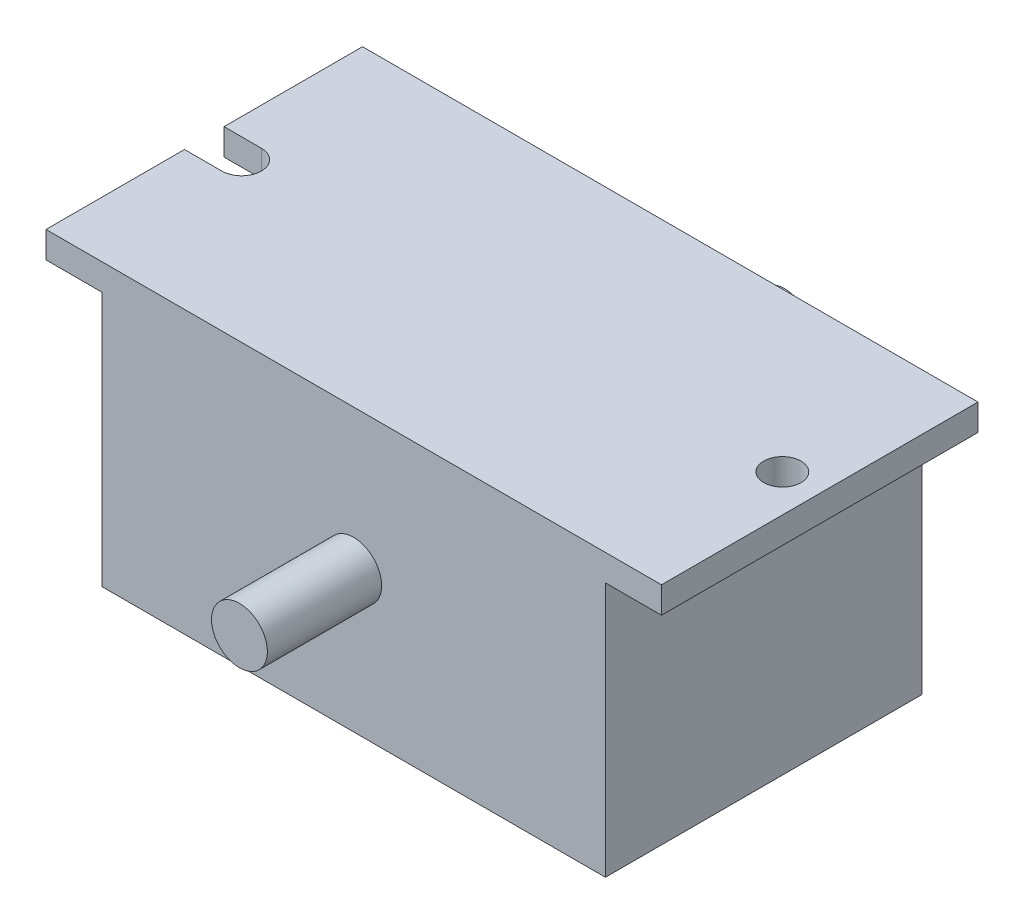
ISO-10303-21;
HEADER;
FILE_DESCRIPTION(('STEP AP214'),'2;1');
FILE_NAME('part.step','',(''),(''),'','','');
FILE_SCHEMA(('AUTOMOTIVE_DESIGN { 1 0 10303 214 1 1 1 1 }'));
ENDSEC;
DATA;
#1=APPLICATION_CONTEXT('core data for automotive mechanical design processes');
#2=APPLICATION_PROTOCOL_DEFINITION('international standard','automotive_design',2000,#1);
#3=PRODUCT_CONTEXT('',#1,'mechanical');
#4=PRODUCT('Part','Part','',(#3));
#5=PRODUCT_RELATED_PRODUCT_CATEGORY('part','',(#4));
#6=PRODUCT_DEFINITION_FORMATION('','',#4);
#7=PRODUCT_DEFINITION_CONTEXT('part definition',#1,'design');
#8=PRODUCT_DEFINITION('design','',#6,#7);
#9=PRODUCT_DEFINITION_SHAPE('','',#8);
#10=(LENGTH_UNIT() NAMED_UNIT(*) SI_UNIT(.MILLI.,.METRE.));
#11=(NAMED_UNIT(*) PLANE_ANGLE_UNIT() SI_UNIT($,.RADIAN.));
#12=(NAMED_UNIT(*) SI_UNIT($,.STERADIAN.) SOLID_ANGLE_UNIT());
#13=UNCERTAINTY_MEASURE_WITH_UNIT(LENGTH_MEASURE(1.E-05),#10,'distance_accuracy_value','');
#14=(GEOMETRIC_REPRESENTATION_CONTEXT(3) GLOBAL_UNCERTAINTY_ASSIGNED_CONTEXT((#13)) GLOBAL_UNIT_ASSIGNED_CONTEXT((#10,
#11,#12)) REPRESENTATION_CONTEXT('',''));
#15=CARTESIAN_POINT('',(0.,0.,0.));
#16=DIRECTION('',(0.,0.,1.));
#17=DIRECTION('',(1.,0.,0.));
#18=AXIS2_PLACEMENT_3D('',#15,#16,#17);
#19=CARTESIAN_POINT('',(-70.,32.,72.));
#20=DIRECTION('',(1.,0.,0.));
#21=DIRECTION('',(0.,0.,-1.));
#22=AXIS2_PLACEMENT_3D('',#19,#20,#21);
#23=PLANE('',#22);
#24=DIRECTION('',(0.,0.,-1.));
#25=VECTOR('',#24,1.);
#26=CARTESIAN_POINT('',(-70.,32.,72.));
#27=LINE('',#26,#25);
#28=CARTESIAN_POINT('',(-70.,32.,72.));
#29=VERTEX_POINT('',#28);
#30=CARTESIAN_POINT('',(-70.,32.,40.5));
#31=VERTEX_POINT('',#30);
#32=EDGE_CURVE('E270',#29,#31,#27,.T.);
#33=ORIENTED_EDGE('',*,*,#32,.T.);
#34=DIRECTION('',(0.,1.,0.));
#35=VECTOR('',#34,1.);
#36=CARTESIAN_POINT('',(-70.,-32.0000000000002,40.5));
#37=LINE('',#36,#35);
#38=CARTESIAN_POINT('',(-70.,26.,40.5));
#39=VERTEX_POINT('',#38);
#40=EDGE_CURVE('E179',#39,#31,#37,.T.);
#41=ORIENTED_EDGE('',*,*,#40,.F.);
#42=DIRECTION('',(0.,0.,-1.));
#43=VECTOR('',#42,1.);
#44=CARTESIAN_POINT('',(-70.,26.,72.));
#45=LINE('',#44,#43);
#46=CARTESIAN_POINT('',(-70.,26.,72.));
#47=VERTEX_POINT('',#46);
#48=EDGE_CURVE('E266',#47,#39,#45,.T.);
#49=ORIENTED_EDGE('',*,*,#48,.F.);
#50=DIRECTION('',(0.,-1.,0.));
#51=VECTOR('',#50,1.);
#52=CARTESIAN_POINT('',(-70.,32.,72.));
#53=LINE('',#52,#51);
#54=EDGE_CURVE('E212',#29,#47,#53,.T.);
#55=ORIENTED_EDGE('',*,*,#54,.F.);
#56=EDGE_LOOP('',(#33,#41,#49,#55));
#57=FACE_BOUND('',#56,.T.);
#58=ADVANCED_FACE('F39',(#57),#23,.F.);
#59=CARTESIAN_POINT('',(-70.,26.,72.));
#60=DIRECTION('',(0.,1.,0.));
#61=DIRECTION('',(0.,0.,1.));
#62=AXIS2_PLACEMENT_3D('',#59,#60,#61);
#63=PLANE('',#62);
#64=DIRECTION('',(1.,0.,0.));
#65=VECTOR('',#64,1.);
#66=CARTESIAN_POINT('',(-70.,26.,40.5));
#67=LINE('',#66,#65);
#68=CARTESIAN_POINT('',(-61.5,26.,40.5));
#69=VERTEX_POINT('',#68);
#70=EDGE_CURVE('E48',#39,#69,#67,.T.);
#71=ORIENTED_EDGE('',*,*,#70,.T.);
#72=CARTESIAN_POINT('',(-61.5,26.,36.));
#73=DIRECTION('',(0.,1.,0.));
#74=DIRECTION('',(0.,0.,1.));
#75=AXIS2_PLACEMENT_3D('',#72,#73,#74);
#76=CIRCLE('',#75,4.5);
#77=CARTESIAN_POINT('',(-57.2500000000001,26.,37.479019945775));
#78=VERTEX_POINT('',#77);
#79=EDGE_CURVE('E188',#69,#78,#76,.T.);
#80=ORIENTED_EDGE('',*,*,#79,.T.);
#81=DIRECTION('',(0.,0.,-1.));
#82=VECTOR('',#81,1.);
#83=CARTESIAN_POINT('',(-57.25,26.,72.));
#84=LINE('',#83,#82);
#85=CARTESIAN_POINT('',(-57.25,26.,72.));
#86=VERTEX_POINT('',#85);
#87=EDGE_CURVE('E261',#86,#78,#84,.T.);
#88=ORIENTED_EDGE('',*,*,#87,.F.);
#89=DIRECTION('',(1.,0.,0.));
#90=VECTOR('',#89,1.);
#91=CARTESIAN_POINT('',(-70.,26.,72.));
#92=LINE('',#91,#90);
#93=EDGE_CURVE('E215',#47,#86,#92,.T.);
#94=ORIENTED_EDGE('',*,*,#93,.F.);
#95=ORIENTED_EDGE('',*,*,#48,.T.);
#96=EDGE_LOOP('',(#71,#80,#88,#94,#95));
#97=FACE_BOUND('',#96,.T.);
#98=ADVANCED_FACE('F294',(#97),#63,.F.);
#99=CARTESIAN_POINT('',(-57.25,26.,72.));
#100=DIRECTION('',(1.,0.,0.));
#101=DIRECTION('',(0.,1.,0.));
#102=AXIS2_PLACEMENT_3D('',#99,#100,#101);
#103=PLANE('',#102);
#104=DIRECTION('',(0.,0.,-1.));
#105=VECTOR('',#104,1.);
#106=CARTESIAN_POINT('',(-57.25,-32.,72.));
#107=LINE('',#106,#105);
#108=CARTESIAN_POINT('',(-57.25,-32.,34.520980054225));
#109=VERTEX_POINT('',#108);
#110=CARTESIAN_POINT('',(-57.25,-32.,0.));
#111=VERTEX_POINT('',#110);
#112=EDGE_CURVE('E255',#109,#111,#107,.T.);
#113=ORIENTED_EDGE('',*,*,#112,.F.);
#114=DIRECTION('',(0.,1.,0.));
#115=VECTOR('',#114,1.);
#116=CARTESIAN_POINT('',(-57.25,-32.0000000000001,34.520980054225));
#117=LINE('',#116,#115);
#118=CARTESIAN_POINT('',(-57.2500000000001,26.,34.520980054225));
#119=VERTEX_POINT('',#118);
#120=EDGE_CURVE('E60',#109,#119,#117,.T.);
#121=ORIENTED_EDGE('',*,*,#120,.T.);
#122=CARTESIAN_POINT('',(-57.25,26.,0.));
#123=VERTEX_POINT('',#122);
#124=EDGE_CURVE('E260',#119,#123,#84,.T.);
#125=ORIENTED_EDGE('',*,*,#124,.T.);
#126=DIRECTION('',(0.,-1.,0.));
#127=VECTOR('',#126,1.);
#128=CARTESIAN_POINT('',(-57.25,26.,0.));
#129=LINE('',#128,#127);
#130=EDGE_CURVE('E246',#123,#111,#129,.T.);
#131=ORIENTED_EDGE('',*,*,#130,.T.);
#132=EDGE_LOOP('',(#113,#121,#125,#131));
#133=FACE_BOUND('',#132,.T.);
#134=ADVANCED_FACE('F370',(#133),#103,.F.);
#135=CARTESIAN_POINT('',(57.25,26.,72.));
#136=DIRECTION('',(-1.,0.,0.));
#137=DIRECTION('',(0.,-1.,0.));
#138=AXIS2_PLACEMENT_3D('',#135,#136,#137);
#139=PLANE('',#138);
#140=DIRECTION('',(0.,0.,-1.));
#141=VECTOR('',#140,1.);
#142=CARTESIAN_POINT('',(57.25,-32.,72.));
#143=LINE('',#142,#141);
#144=CARTESIAN_POINT('',(57.25,-32.,72.));
#145=VERTEX_POINT('',#144);
#146=CARTESIAN_POINT('',(57.25,-32.,0.));
#147=VERTEX_POINT('',#146);
#148=EDGE_CURVE('E224',#145,#147,#143,.T.);
#149=ORIENTED_EDGE('',*,*,#148,.T.);
#150=DIRECTION('',(0.,1.,0.));
#151=VECTOR('',#150,1.);
#152=CARTESIAN_POINT('',(57.25,26.,0.));
#153=LINE('',#152,#151);
#154=CARTESIAN_POINT('',(57.25,26.,0.));
#155=VERTEX_POINT('',#154);
#156=EDGE_CURVE('E197',#147,#155,#153,.T.);
#157=ORIENTED_EDGE('',*,*,#156,.T.);
#158=DIRECTION('',(0.,0.,-1.));
#159=VECTOR('',#158,1.);
#160=CARTESIAN_POINT('',(57.25,26.,72.));
#161=LINE('',#160,#159);
#162=CARTESIAN_POINT('',(57.25,26.,36.));
#163=VERTEX_POINT('',#162);
#164=EDGE_CURVE('E282',#163,#155,#161,.T.);
#165=ORIENTED_EDGE('',*,*,#164,.F.);
#166=CARTESIAN_POINT('',(57.25,26.,72.));
#167=VERTEX_POINT('',#166);
#168=EDGE_CURVE('E283',#167,#163,#161,.T.);
#169=ORIENTED_EDGE('',*,*,#168,.F.);
#170=DIRECTION('',(0.,1.,0.));
#171=VECTOR('',#170,1.);
#172=CARTESIAN_POINT('',(57.25,26.,72.));
#173=LINE('',#172,#171);
#174=EDGE_CURVE('E198',#145,#167,#173,.T.);
#175=ORIENTED_EDGE('',*,*,#174,.F.);
#176=EDGE_LOOP('',(#149,#157,#165,#169,#175));
#177=FACE_BOUND('',#176,.T.);
#178=ADVANCED_FACE('F41',(#177),#139,.F.);
#179=CARTESIAN_POINT('',(70.,26.,72.));
#180=DIRECTION('',(0.,1.,0.));
#181=DIRECTION('',(0.,0.,1.));
#182=AXIS2_PLACEMENT_3D('',#179,#180,#181);
#183=PLANE('',#182);
#184=ORIENTED_EDGE('',*,*,#168,.T.);
#185=CARTESIAN_POINT('',(61.5,26.,36.));
#186=DIRECTION('',(0.,1.,0.));
#187=DIRECTION('',(0.,0.,1.));
#188=AXIS2_PLACEMENT_3D('',#185,#186,#187);
#189=CIRCLE('',#188,4.25);
#190=EDGE_CURVE('E53',#163,#163,#189,.T.);
#191=ORIENTED_EDGE('',*,*,#190,.T.);
#192=ORIENTED_EDGE('',*,*,#164,.T.);
#193=DIRECTION('',(1.,0.,0.));
#194=VECTOR('',#193,1.);
#195=CARTESIAN_POINT('',(70.,26.,0.));
#196=LINE('',#195,#194);
#197=CARTESIAN_POINT('',(70.,26.,0.));
#198=VERTEX_POINT('',#197);
#199=EDGE_CURVE('E228',#155,#198,#196,.T.);
#200=ORIENTED_EDGE('',*,*,#199,.T.);
#201=DIRECTION('',(0.,0.,-1.));
#202=VECTOR('',#201,1.);
#203=CARTESIAN_POINT('',(70.,26.,72.));
#204=LINE('',#203,#202);
#205=CARTESIAN_POINT('',(70.,26.,72.));
#206=VERTEX_POINT('',#205);
#207=EDGE_CURVE('E278',#206,#198,#204,.T.);
#208=ORIENTED_EDGE('',*,*,#207,.F.);
#209=DIRECTION('',(1.,0.,0.));
#210=VECTOR('',#209,1.);
#211=CARTESIAN_POINT('',(70.,26.,72.));
#212=LINE('',#211,#210);
#213=EDGE_CURVE('E202',#167,#206,#212,.T.);
#214=ORIENTED_EDGE('',*,*,#213,.F.);
#215=EDGE_LOOP('',(#184,#191,#192,#200,#208,#214));
#216=FACE_BOUND('',#215,.T.);
#217=ADVANCED_FACE('F385',(#216),#183,.F.);
#218=CARTESIAN_POINT('',(70.,32.,72.));
#219=DIRECTION('',(-1.,0.,0.));
#220=DIRECTION('',(0.,0.,1.));
#221=AXIS2_PLACEMENT_3D('',#218,#219,#220);
#222=PLANE('',#221);
#223=DIRECTION('',(0.,1.,0.));
#224=VECTOR('',#223,1.);
#225=CARTESIAN_POINT('',(70.,32.,0.));
#226=LINE('',#225,#224);
#227=CARTESIAN_POINT('',(70.,32.,0.));
#228=VERTEX_POINT('',#227);
#229=EDGE_CURVE('E231',#198,#228,#226,.T.);
#230=ORIENTED_EDGE('',*,*,#229,.T.);
#231=DIRECTION('',(0.,0.,-1.));
#232=VECTOR('',#231,1.);
#233=CARTESIAN_POINT('',(70.,32.,72.));
#234=LINE('',#233,#232);
#235=CARTESIAN_POINT('',(70.,32.,72.));
#236=VERTEX_POINT('',#235);
#237=EDGE_CURVE('E274',#236,#228,#234,.T.);
#238=ORIENTED_EDGE('',*,*,#237,.F.);
#239=DIRECTION('',(0.,1.,0.));
#240=VECTOR('',#239,1.);
#241=CARTESIAN_POINT('',(70.,32.,72.));
#242=LINE('',#241,#240);
#243=EDGE_CURVE('E206',#206,#236,#242,.T.);
#244=ORIENTED_EDGE('',*,*,#243,.F.);
#245=ORIENTED_EDGE('',*,*,#207,.T.);
#246=EDGE_LOOP('',(#230,#238,#244,#245));
#247=FACE_BOUND('',#246,.T.);
#248=ADVANCED_FACE('F311',(#247),#222,.F.);
#249=CARTESIAN_POINT('',(-57.25,32.,72.));
#250=DIRECTION('',(0.,-1.,0.));
#251=DIRECTION('',(1.,0.,0.));
#252=AXIS2_PLACEMENT_3D('',#249,#250,#251);
#253=PLANE('',#252);
#254=CARTESIAN_POINT('',(61.5,32.0000000000001,36.));
#255=DIRECTION('',(0.,1.,0.));
#256=DIRECTION('',(-1.,0.,0.));
#257=AXIS2_PLACEMENT_3D('',#254,#255,#256);
#258=CIRCLE('',#257,4.25);
#259=CARTESIAN_POINT('',(57.25,32.0000000000001,36.));
#260=VERTEX_POINT('',#259);
#261=EDGE_CURVE('E178',#260,#260,#258,.T.);
#262=ORIENTED_EDGE('',*,*,#261,.F.);
#263=EDGE_LOOP('',(#262));
#264=FACE_BOUND('',#263,.T.);
#265=CARTESIAN_POINT('',(-61.5,32.,36.));
#266=DIRECTION('',(0.,1.,0.));
#267=DIRECTION('',(-1.,0.,0.));
#268=AXIS2_PLACEMENT_3D('',#265,#266,#267);
#269=CIRCLE('',#268,4.5);
#270=CARTESIAN_POINT('',(-61.5,32.,40.5));
#271=VERTEX_POINT('',#270);
#272=CARTESIAN_POINT('',(-61.5,32.,31.5));
#273=VERTEX_POINT('',#272);
#274=EDGE_CURVE('E156',#271,#273,#269,.T.);
#275=ORIENTED_EDGE('',*,*,#274,.F.);
#276=DIRECTION('',(1.,0.,0.));
#277=VECTOR('',#276,1.);
#278=CARTESIAN_POINT('',(-61.5,32.,40.5));
#279=LINE('',#278,#277);
#280=EDGE_CURVE('E153',#31,#271,#279,.T.);
#281=ORIENTED_EDGE('',*,*,#280,.F.);
#282=ORIENTED_EDGE('',*,*,#32,.F.);
#283=DIRECTION('',(-1.,0.,0.));
#284=VECTOR('',#283,1.);
#285=CARTESIAN_POINT('',(57.25,32.,72.));
#286=LINE('',#285,#284);
#287=EDGE_CURVE('E209',#236,#29,#286,.T.);
#288=ORIENTED_EDGE('',*,*,#287,.F.);
#289=ORIENTED_EDGE('',*,*,#237,.T.);
#290=DIRECTION('',(-1.,0.,0.));
#291=VECTOR('',#290,1.);
#292=CARTESIAN_POINT('',(-57.25,32.,0.));
#293=LINE('',#292,#291);
#294=CARTESIAN_POINT('',(-70.,32.,0.));
#295=VERTEX_POINT('',#294);
#296=EDGE_CURVE('E235',#228,#295,#293,.T.);
#297=ORIENTED_EDGE('',*,*,#296,.T.);
#298=CARTESIAN_POINT('',(-70.,32.,31.5));
#299=VERTEX_POINT('',#298);
#300=EDGE_CURVE('E169',#299,#295,#27,.T.);
#301=ORIENTED_EDGE('',*,*,#300,.F.);
#302=DIRECTION('',(-1.,0.,0.));
#303=VECTOR('',#302,1.);
#304=CARTESIAN_POINT('',(-61.5,32.,31.5));
#305=LINE('',#304,#303);
#306=EDGE_CURVE('E146',#273,#299,#305,.T.);
#307=ORIENTED_EDGE('',*,*,#306,.F.);
#308=EDGE_LOOP('',(#275,#281,#282,#288,#289,#297,#301,#307));
#309=FACE_BOUND('',#308,.T.);
#310=ADVANCED_FACE('F167',(#264,#309),#253,.F.);
#311=CARTESIAN_POINT('',(-70.,26.,31.5));
#312=VERTEX_POINT('',#311);
#313=CARTESIAN_POINT('',(-70.,26.,0.));
#314=VERTEX_POINT('',#313);
#315=EDGE_CURVE('E265',#312,#314,#45,.T.);
#316=ORIENTED_EDGE('',*,*,#315,.F.);
#317=DIRECTION('',(0.,1.,0.));
#318=VECTOR('',#317,1.);
#319=CARTESIAN_POINT('',(-70.,-32.0000000000002,31.5));
#320=LINE('',#319,#318);
#321=EDGE_CURVE('E152',#312,#299,#320,.T.);
#322=ORIENTED_EDGE('',*,*,#321,.T.);
#323=ORIENTED_EDGE('',*,*,#300,.T.);
#324=DIRECTION('',(0.,-1.,0.));
#325=VECTOR('',#324,1.);
#326=CARTESIAN_POINT('',(-70.,32.,0.));
#327=LINE('',#326,#325);
#328=EDGE_CURVE('E238',#295,#314,#327,.T.);
#329=ORIENTED_EDGE('',*,*,#328,.T.);
#330=EDGE_LOOP('',(#316,#322,#323,#329));
#331=FACE_BOUND('',#330,.T.);
#332=ADVANCED_FACE('F322',(#331),#23,.F.);
#333=ORIENTED_EDGE('',*,*,#124,.F.);
#334=CARTESIAN_POINT('',(-61.5,26.,31.5));
#335=VERTEX_POINT('',#334);
#336=EDGE_CURVE('E192',#119,#335,#76,.T.);
#337=ORIENTED_EDGE('',*,*,#336,.T.);
#338=DIRECTION('',(-1.,0.,0.));
#339=VECTOR('',#338,1.);
#340=CARTESIAN_POINT('',(-70.,26.,31.5));
#341=LINE('',#340,#339);
#342=EDGE_CURVE('E149',#335,#312,#341,.T.);
#343=ORIENTED_EDGE('',*,*,#342,.T.);
#344=ORIENTED_EDGE('',*,*,#315,.T.);
#345=DIRECTION('',(1.,0.,0.));
#346=VECTOR('',#345,1.);
#347=CARTESIAN_POINT('',(-70.,26.,0.));
#348=LINE('',#347,#346);
#349=EDGE_CURVE('E242',#314,#123,#348,.T.);
#350=ORIENTED_EDGE('',*,*,#349,.T.);
#351=EDGE_LOOP('',(#333,#337,#343,#344,#350));
#352=FACE_BOUND('',#351,.T.);
#353=ADVANCED_FACE('F372',(#352),#63,.F.);
#354=ORIENTED_EDGE('',*,*,#87,.T.);
#355=DIRECTION('',(0.,1.,0.));
#356=VECTOR('',#355,1.);
#357=CARTESIAN_POINT('',(-57.25,-32.0000000000001,37.479019945775));
#358=LINE('',#357,#356);
#359=CARTESIAN_POINT('',(-57.25,-32.0000000000001,37.479019945775));
#360=VERTEX_POINT('',#359);
#361=EDGE_CURVE('E184',#78,#360,#358,.F.);
#362=ORIENTED_EDGE('',*,*,#361,.T.);
#363=CARTESIAN_POINT('',(-57.25,-32.,72.));
#364=VERTEX_POINT('',#363);
#365=EDGE_CURVE('E256',#364,#360,#107,.T.);
#366=ORIENTED_EDGE('',*,*,#365,.F.);
#367=DIRECTION('',(0.,-1.,0.));
#368=VECTOR('',#367,1.);
#369=CARTESIAN_POINT('',(-57.25,26.,72.));
#370=LINE('',#369,#368);
#371=EDGE_CURVE('E218',#86,#364,#370,.T.);
#372=ORIENTED_EDGE('',*,*,#371,.F.);
#373=EDGE_LOOP('',(#354,#362,#366,#372));
#374=FACE_BOUND('',#373,.T.);
#375=ADVANCED_FACE('F379',(#374),#103,.F.);
#376=CARTESIAN_POINT('',(-57.25,-32.,72.));
#377=DIRECTION('',(0.,1.,0.));
#378=DIRECTION('',(0.,0.,1.));
#379=AXIS2_PLACEMENT_3D('',#376,#377,#378);
#380=PLANE('',#379);
#381=ORIENTED_EDGE('',*,*,#365,.T.);
#382=CARTESIAN_POINT('',(-61.5,-32.,36.));
#383=DIRECTION('',(0.,1.,0.));
#384=DIRECTION('',(0.,0.,1.));
#385=AXIS2_PLACEMENT_3D('',#382,#383,#384);
#386=CIRCLE('',#385,4.5);
#387=EDGE_CURVE('E287',#360,#109,#386,.T.);
#388=ORIENTED_EDGE('',*,*,#387,.T.);
#389=ORIENTED_EDGE('',*,*,#112,.T.);
#390=DIRECTION('',(1.,0.,0.));
#391=VECTOR('',#390,1.);
#392=CARTESIAN_POINT('',(-57.25,-32.,0.));
#393=LINE('',#392,#391);
#394=EDGE_CURVE('E203',#111,#147,#393,.T.);
#395=ORIENTED_EDGE('',*,*,#394,.T.);
#396=ORIENTED_EDGE('',*,*,#148,.F.);
#397=DIRECTION('',(1.,0.,0.));
#398=VECTOR('',#397,1.);
#399=CARTESIAN_POINT('',(-57.25,-32.,72.));
#400=LINE('',#399,#398);
#401=EDGE_CURVE('E221',#364,#145,#400,.T.);
#402=ORIENTED_EDGE('',*,*,#401,.F.);
#403=EDGE_LOOP('',(#381,#388,#389,#395,#396,#402));
#404=FACE_BOUND('',#403,.T.);
#405=ADVANCED_FACE('F361',(#404),#380,.F.);
#406=CARTESIAN_POINT('',(0.,0.,72.));
#407=DIRECTION('',(0.,0.,1.));
#408=DIRECTION('',(1.,0.,0.));
#409=AXIS2_PLACEMENT_3D('',#406,#407,#408);
#410=PLANE('',#409);
#411=CARTESIAN_POINT('',(0.,0.,72.));
#412=DIRECTION('',(0.,0.,1.));
#413=DIRECTION('',(1.,0.,0.));
#414=AXIS2_PLACEMENT_3D('',#411,#412,#413);
#415=CIRCLE('',#414,6.35);
#416=CARTESIAN_POINT('',(-6.35,0.,72.));
#417=VERTEX_POINT('',#416);
#418=EDGE_CURVE('E333',#417,#417,#415,.T.);
#419=ORIENTED_EDGE('',*,*,#418,.F.);
#420=EDGE_LOOP('',(#419));
#421=FACE_BOUND('',#420,.T.);
#422=ORIENTED_EDGE('',*,*,#174,.T.);
#423=ORIENTED_EDGE('',*,*,#213,.T.);
#424=ORIENTED_EDGE('',*,*,#243,.T.);
#425=ORIENTED_EDGE('',*,*,#287,.T.);
#426=ORIENTED_EDGE('',*,*,#54,.T.);
#427=ORIENTED_EDGE('',*,*,#93,.T.);
#428=ORIENTED_EDGE('',*,*,#371,.T.);
#429=ORIENTED_EDGE('',*,*,#401,.T.);
#430=EDGE_LOOP('',(#422,#423,#424,#425,#426,#427,#428,#429));
#431=FACE_BOUND('',#430,.T.);
#432=ADVANCED_FACE('F307',(#421,#431),#410,.T.);
#433=CARTESIAN_POINT('',(0.,0.,0.));
#434=DIRECTION('',(0.,0.,1.));
#435=DIRECTION('',(1.,0.,0.));
#436=AXIS2_PLACEMENT_3D('',#433,#434,#435);
#437=PLANE('',#436);
#438=CARTESIAN_POINT('',(0.,0.,0.));
#439=DIRECTION('',(0.,0.,1.));
#440=DIRECTION('',(1.,0.,0.));
#441=AXIS2_PLACEMENT_3D('',#438,#439,#440);
#442=CIRCLE('',#441,6.35);
#443=CARTESIAN_POINT('',(6.35,0.,0.));
#444=VERTEX_POINT('',#443);
#445=EDGE_CURVE('E11',#444,#444,#442,.F.);
#446=ORIENTED_EDGE('',*,*,#445,.F.);
#447=EDGE_LOOP('',(#446));
#448=FACE_BOUND('',#447,.T.);
#449=ORIENTED_EDGE('',*,*,#156,.F.);
#450=ORIENTED_EDGE('',*,*,#394,.F.);
#451=ORIENTED_EDGE('',*,*,#130,.F.);
#452=ORIENTED_EDGE('',*,*,#349,.F.);
#453=ORIENTED_EDGE('',*,*,#328,.F.);
#454=ORIENTED_EDGE('',*,*,#296,.F.);
#455=ORIENTED_EDGE('',*,*,#229,.F.);
#456=ORIENTED_EDGE('',*,*,#199,.F.);
#457=EDGE_LOOP('',(#449,#450,#451,#452,#453,#454,#455,#456));
#458=FACE_BOUND('',#457,.T.);
#459=ADVANCED_FACE('F316',(#448,#458),#437,.F.);
#460=CARTESIAN_POINT('',(-61.5,-32.0000000000001,40.5));
#461=DIRECTION('',(0.,0.,1.));
#462=DIRECTION('',(1.,0.,0.));
#463=AXIS2_PLACEMENT_3D('',#460,#461,#462);
#464=PLANE('',#463);
#465=ORIENTED_EDGE('',*,*,#40,.T.);
#466=ORIENTED_EDGE('',*,*,#280,.T.);
#467=DIRECTION('',(0.,1.,0.));
#468=VECTOR('',#467,1.);
#469=CARTESIAN_POINT('',(-61.5,-32.0000000000001,40.5));
#470=LINE('',#469,#468);
#471=EDGE_CURVE('E159',#69,#271,#470,.T.);
#472=ORIENTED_EDGE('',*,*,#471,.F.);
#473=ORIENTED_EDGE('',*,*,#70,.F.);
#474=EDGE_LOOP('',(#465,#466,#472,#473));
#475=FACE_BOUND('',#474,.T.);
#476=ADVANCED_FACE('F300',(#475),#464,.F.);
#477=CARTESIAN_POINT('',(-61.5,-32.0000000000001,31.5));
#478=DIRECTION('',(0.,0.,-1.));
#479=DIRECTION('',(-1.,0.,0.));
#480=AXIS2_PLACEMENT_3D('',#477,#478,#479);
#481=PLANE('',#480);
#482=DIRECTION('',(0.,1.,0.));
#483=VECTOR('',#482,1.);
#484=CARTESIAN_POINT('',(-61.5,-32.0000000000001,31.5));
#485=LINE('',#484,#483);
#486=EDGE_CURVE('E142',#335,#273,#485,.T.);
#487=ORIENTED_EDGE('',*,*,#486,.T.);
#488=ORIENTED_EDGE('',*,*,#306,.T.);
#489=ORIENTED_EDGE('',*,*,#321,.F.);
#490=ORIENTED_EDGE('',*,*,#342,.F.);
#491=EDGE_LOOP('',(#487,#488,#489,#490));
#492=FACE_BOUND('',#491,.T.);
#493=ADVANCED_FACE('F144',(#492),#481,.F.);
#494=CARTESIAN_POINT('',(-61.5,-32.0000000000001,36.));
#495=DIRECTION('',(0.,1.,0.));
#496=DIRECTION('',(-1.,0.,0.));
#497=AXIS2_PLACEMENT_3D('',#494,#495,#496);
#498=CYLINDRICAL_SURFACE('',#497,4.5);
#499=ORIENTED_EDGE('',*,*,#120,.F.);
#500=ORIENTED_EDGE('',*,*,#387,.F.);
#501=ORIENTED_EDGE('',*,*,#361,.F.);
#502=ORIENTED_EDGE('',*,*,#79,.F.);
#503=ORIENTED_EDGE('',*,*,#471,.T.);
#504=ORIENTED_EDGE('',*,*,#274,.T.);
#505=ORIENTED_EDGE('',*,*,#486,.F.);
#506=ORIENTED_EDGE('',*,*,#336,.F.);
#507=EDGE_LOOP('',(#499,#500,#501,#502,#503,#504,#505,#506));
#508=FACE_BOUND('',#507,.T.);
#509=ADVANCED_FACE('F157',(#508),#498,.F.);
#510=CARTESIAN_POINT('',(61.5,-32.,36.));
#511=DIRECTION('',(0.,1.,0.));
#512=DIRECTION('',(-1.,0.,0.));
#513=AXIS2_PLACEMENT_3D('',#510,#511,#512);
#514=CYLINDRICAL_SURFACE('',#513,4.25);
#515=ORIENTED_EDGE('',*,*,#261,.T.);
#516=EDGE_LOOP('',(#515));
#517=FACE_BOUND('',#516,.T.);
#518=ORIENTED_EDGE('',*,*,#190,.F.);
#519=EDGE_LOOP('',(#518));
#520=FACE_BOUND('',#519,.T.);
#521=ADVANCED_FACE('F429',(#517,#520),#514,.F.);
#522=CARTESIAN_POINT('',(0.,0.,98.));
#523=DIRECTION('',(0.,0.,-1.));
#524=DIRECTION('',(-1.,0.,0.));
#525=AXIS2_PLACEMENT_3D('',#522,#523,#524);
#526=CYLINDRICAL_SURFACE('',#525,6.35);
#527=CARTESIAN_POINT('',(0.,0.,98.));
#528=DIRECTION('',(0.,0.,1.));
#529=DIRECTION('',(1.,0.,0.));
#530=AXIS2_PLACEMENT_3D('',#527,#528,#529);
#531=CIRCLE('',#530,6.35);
#532=CARTESIAN_POINT('',(-6.35,0.,98.));
#533=VERTEX_POINT('',#532);
#534=EDGE_CURVE('E164',#533,#533,#531,.T.);
#535=CARTESIAN_POINT('',(-6.35,0.,98.));
#536=CARTESIAN_POINT('',(-6.35,0.,97.7291666666667));
#537=CARTESIAN_POINT('',(-6.35,0.,97.4583333333333));
#538=CARTESIAN_POINT('',(-6.35,0.,96.9166666666667));
#539=CARTESIAN_POINT('',(-6.35,0.,96.6458333333333));
#540=CARTESIAN_POINT('',(-6.35,0.,96.1041666666667));
#541=CARTESIAN_POINT('',(-6.35,0.,95.8333333333333));
#542=CARTESIAN_POINT('',(-6.35,0.,95.2916666666666));
#543=CARTESIAN_POINT('',(-6.35,0.,95.0208333333333));
#544=CARTESIAN_POINT('',(-6.35,0.,94.4791666666667));
#545=CARTESIAN_POINT('',(-6.35,0.,94.2083333333333));
#546=CARTESIAN_POINT('',(-6.35,0.,93.6666666666666));
#547=CARTESIAN_POINT('',(-6.35,0.,93.3958333333333));
#548=CARTESIAN_POINT('',(-6.35,0.,92.8541666666667));
#549=CARTESIAN_POINT('',(-6.35,0.,92.5833333333333));
#550=CARTESIAN_POINT('',(-6.35,0.,92.0416666666667));
#551=CARTESIAN_POINT('',(-6.35,0.,91.7708333333333));
#552=CARTESIAN_POINT('',(-6.35,0.,91.2291666666667));
#553=CARTESIAN_POINT('',(-6.35,0.,90.9583333333333));
#554=CARTESIAN_POINT('',(-6.35,0.,90.4166666666667));
#555=CARTESIAN_POINT('',(-6.35,0.,90.1458333333333));
#556=CARTESIAN_POINT('',(-6.35,0.,89.6041666666667));
#557=CARTESIAN_POINT('',(-6.35,0.,89.3333333333333));
#558=CARTESIAN_POINT('',(-6.35,0.,88.7916666666667));
#559=CARTESIAN_POINT('',(-6.35,0.,88.5208333333333));
#560=CARTESIAN_POINT('',(-6.35,0.,87.9791666666666));
#561=CARTESIAN_POINT('',(-6.35,0.,87.7083333333333));
#562=CARTESIAN_POINT('',(-6.35,0.,87.1666666666667));
#563=CARTESIAN_POINT('',(-6.35,0.,86.8958333333333));
#564=CARTESIAN_POINT('',(-6.35,0.,86.3541666666666));
#565=CARTESIAN_POINT('',(-6.35,0.,86.0833333333333));
#566=CARTESIAN_POINT('',(-6.35,0.,85.5416666666667));
#567=CARTESIAN_POINT('',(-6.35,0.,85.2708333333333));
#568=CARTESIAN_POINT('',(-6.35,0.,84.7291666666667));
#569=CARTESIAN_POINT('',(-6.35,0.,84.4583333333333));
#570=CARTESIAN_POINT('',(-6.35,0.,83.9166666666667));
#571=CARTESIAN_POINT('',(-6.35,0.,83.6458333333333));
#572=CARTESIAN_POINT('',(-6.35,0.,83.1041666666667));
#573=CARTESIAN_POINT('',(-6.35,0.,82.8333333333333));
#574=CARTESIAN_POINT('',(-6.35,0.,82.2916666666667));
#575=CARTESIAN_POINT('',(-6.35,0.,82.0208333333333));
#576=CARTESIAN_POINT('',(-6.35,0.,81.4791666666667));
#577=CARTESIAN_POINT('',(-6.35,0.,81.2083333333333));
#578=CARTESIAN_POINT('',(-6.35,0.,80.6666666666667));
#579=CARTESIAN_POINT('',(-6.35,0.,80.3958333333333));
#580=CARTESIAN_POINT('',(-6.35,0.,79.8541666666667));
#581=CARTESIAN_POINT('',(-6.35,0.,79.5833333333333));
#582=CARTESIAN_POINT('',(-6.35,0.,79.0416666666667));
#583=CARTESIAN_POINT('',(-6.35,0.,78.7708333333333));
#584=CARTESIAN_POINT('',(-6.35,0.,78.2291666666667));
#585=CARTESIAN_POINT('',(-6.35,0.,77.9583333333333));
#586=CARTESIAN_POINT('',(-6.35,0.,77.4166666666667));
#587=CARTESIAN_POINT('',(-6.35,0.,77.1458333333333));
#588=CARTESIAN_POINT('',(-6.35,0.,76.6041666666667));
#589=CARTESIAN_POINT('',(-6.35,0.,76.3333333333333));
#590=CARTESIAN_POINT('',(-6.35,0.,75.7916666666667));
#591=CARTESIAN_POINT('',(-6.35,0.,75.5208333333333));
#592=CARTESIAN_POINT('',(-6.35,0.,74.9791666666667));
#593=CARTESIAN_POINT('',(-6.35,0.,74.7083333333333));
#594=CARTESIAN_POINT('',(-6.35,0.,74.1666666666667));
#595=CARTESIAN_POINT('',(-6.35,0.,73.8958333333333));
#596=CARTESIAN_POINT('',(-6.35,0.,73.3541666666667));
#597=CARTESIAN_POINT('',(-6.35,0.,73.0833333333333));
#598=CARTESIAN_POINT('',(-6.35,0.,72.5416666666667));
#599=CARTESIAN_POINT('',(-6.35,0.,72.2708333333333));
#600=CARTESIAN_POINT('',(-6.35,0.,72.));
#601=B_SPLINE_CURVE_WITH_KNOTS('',3,(#535,#536,#537,#538,#539,#540,#541,#542,#543,#544,#545,
#546,#547,#548,#549,#550,#551,#552,#553,#554,#555,#556,#557,#558,#559,#560,#561,#562,#563,#564,
#565,#566,#567,#568,#569,#570,#571,#572,#573,#574,#575,#576,#577,#578,#579,#580,#581,#582,#583,
#584,#585,#586,#587,#588,#589,#590,#591,#592,#593,#594,#595,#596,#597,#598,#599,#600),
.UNSPECIFIED.,.F.,.F.,(4,2,2,2,2,2,2,2,2,2,2,2,2,2,2,2,2,2,2,2,2,2,2,2,2,2,2,2,2,2,2,2,4),(0.,
0.812500000000008,1.625,2.43750000000001,3.25,4.06250000000001,4.875,5.6875,6.50000000000001,
7.3125,8.12500000000001,8.9375,9.75000000000001,10.5625,11.375,12.1875,13.,13.8125,14.625,
15.4375,16.25,17.0625,17.875,18.6875,19.5,20.3125,21.125,21.9375,22.75,23.5625,24.375,25.1875,
26.),.UNSPECIFIED.);
#602=EDGE_CURVE('BSEAM434',#533,#417,#601,.T.);
#603=ORIENTED_EDGE('',*,*,#534,.F.);
#604=ORIENTED_EDGE('',*,*,#418,.T.);
#605=ORIENTED_EDGE('',*,*,#602,.T.);
#606=ORIENTED_EDGE('',*,*,#602,.F.);
#607=EDGE_LOOP('',(#603,#605,#604,#606));
#608=FACE_BOUND('',#607,.T.);
#609=ADVANCED_FACE('F434',(#608),#526,.T.);
#610=CARTESIAN_POINT('',(0.,0.,98.));
#611=DIRECTION('',(0.,0.,1.));
#612=DIRECTION('',(1.,0.,0.));
#613=AXIS2_PLACEMENT_3D('',#610,#611,#612);
#614=PLANE('',#613);
#615=ORIENTED_EDGE('',*,*,#534,.T.);
#616=EDGE_LOOP('',(#615));
#617=FACE_BOUND('',#616,.T.);
#618=ADVANCED_FACE('F350',(#617),#614,.T.);
#619=CARTESIAN_POINT('',(0.,0.,-26.));
#620=DIRECTION('',(0.,0.,1.));
#621=DIRECTION('',(1.,0.,0.));
#622=AXIS2_PLACEMENT_3D('',#619,#620,#621);
#623=CYLINDRICAL_SURFACE('',#622,6.35);
#624=CARTESIAN_POINT('',(0.,0.,-26.));
#625=DIRECTION('',(0.,0.,-1.));
#626=DIRECTION('',(-1.,0.,0.));
#627=AXIS2_PLACEMENT_3D('',#624,#625,#626);
#628=CIRCLE('',#627,6.35);
#629=CARTESIAN_POINT('',(6.35,0.,-26.));
#630=VERTEX_POINT('',#629);
#631=EDGE_CURVE('E337',#630,#630,#628,.T.);
#632=CARTESIAN_POINT('',(6.35,0.,-26.));
#633=CARTESIAN_POINT('',(6.35,0.,-25.7291666666667));
#634=CARTESIAN_POINT('',(6.35,0.,-25.4583333333333));
#635=CARTESIAN_POINT('',(6.35,0.,-24.9166666666667));
#636=CARTESIAN_POINT('',(6.35,0.,-24.6458333333333));
#637=CARTESIAN_POINT('',(6.35,0.,-24.1041666666667));
#638=CARTESIAN_POINT('',(6.35,0.,-23.8333333333333));
#639=CARTESIAN_POINT('',(6.35,0.,-23.2916666666667));
#640=CARTESIAN_POINT('',(6.35,0.,-23.0208333333333));
#641=CARTESIAN_POINT('',(6.35,0.,-22.4791666666667));
#642=CARTESIAN_POINT('',(6.35,0.,-22.2083333333333));
#643=CARTESIAN_POINT('',(6.35,0.,-21.6666666666667));
#644=CARTESIAN_POINT('',(6.35,0.,-21.3958333333333));
#645=CARTESIAN_POINT('',(6.35,0.,-20.8541666666667));
#646=CARTESIAN_POINT('',(6.35,0.,-20.5833333333333));
#647=CARTESIAN_POINT('',(6.35,0.,-20.0416666666667));
#648=CARTESIAN_POINT('',(6.35,0.,-19.7708333333333));
#649=CARTESIAN_POINT('',(6.35,0.,-19.2291666666667));
#650=CARTESIAN_POINT('',(6.35,0.,-18.9583333333333));
#651=CARTESIAN_POINT('',(6.35,0.,-18.4166666666667));
#652=CARTESIAN_POINT('',(6.35,0.,-18.1458333333333));
#653=CARTESIAN_POINT('',(6.35,0.,-17.6041666666667));
#654=CARTESIAN_POINT('',(6.35,0.,-17.3333333333333));
#655=CARTESIAN_POINT('',(6.35,0.,-16.7916666666667));
#656=CARTESIAN_POINT('',(6.35,0.,-16.5208333333333));
#657=CARTESIAN_POINT('',(6.35,0.,-15.9791666666667));
#658=CARTESIAN_POINT('',(6.35,0.,-15.7083333333333));
#659=CARTESIAN_POINT('',(6.35,0.,-15.1666666666667));
#660=CARTESIAN_POINT('',(6.35,0.,-14.8958333333333));
#661=CARTESIAN_POINT('',(6.35,0.,-14.3541666666667));
#662=CARTESIAN_POINT('',(6.35,0.,-14.0833333333333));
#663=CARTESIAN_POINT('',(6.35,0.,-13.5416666666667));
#664=CARTESIAN_POINT('',(6.35,0.,-13.2708333333333));
#665=CARTESIAN_POINT('',(6.35,0.,-12.7291666666667));
#666=CARTESIAN_POINT('',(6.35,0.,-12.4583333333333));
#667=CARTESIAN_POINT('',(6.35,0.,-11.9166666666667));
#668=CARTESIAN_POINT('',(6.35,0.,-11.6458333333333));
#669=CARTESIAN_POINT('',(6.35,0.,-11.1041666666667));
#670=CARTESIAN_POINT('',(6.35,0.,-10.8333333333333));
#671=CARTESIAN_POINT('',(6.35,0.,-10.2916666666667));
#672=CARTESIAN_POINT('',(6.35,0.,-10.0208333333333));
#673=CARTESIAN_POINT('',(6.35,0.,-9.47916666666667));
#674=CARTESIAN_POINT('',(6.35,0.,-9.20833333333333));
#675=CARTESIAN_POINT('',(6.35,0.,-8.66666666666667));
#676=CARTESIAN_POINT('',(6.35,0.,-8.39583333333333));
#677=CARTESIAN_POINT('',(6.35,0.,-7.85416666666667));
#678=CARTESIAN_POINT('',(6.35,0.,-7.58333333333333));
#679=CARTESIAN_POINT('',(6.35,0.,-7.04166666666667));
#680=CARTESIAN_POINT('',(6.35,0.,-6.77083333333333));
#681=CARTESIAN_POINT('',(6.35,0.,-6.22916666666667));
#682=CARTESIAN_POINT('',(6.35,0.,-5.95833333333333));
#683=CARTESIAN_POINT('',(6.35,0.,-5.41666666666667));
#684=CARTESIAN_POINT('',(6.35,0.,-5.14583333333333));
#685=CARTESIAN_POINT('',(6.35,0.,-4.60416666666667));
#686=CARTESIAN_POINT('',(6.35,0.,-4.33333333333333));
#687=CARTESIAN_POINT('',(6.35,0.,-3.79166666666667));
#688=CARTESIAN_POINT('',(6.35,0.,-3.52083333333333));
#689=CARTESIAN_POINT('',(6.35,0.,-2.97916666666667));
#690=CARTESIAN_POINT('',(6.35,0.,-2.70833333333333));
#691=CARTESIAN_POINT('',(6.35,0.,-2.16666666666667));
#692=CARTESIAN_POINT('',(6.35,0.,-1.89583333333333));
#693=CARTESIAN_POINT('',(6.35,0.,-1.35416666666667));
#694=CARTESIAN_POINT('',(6.35,0.,-1.08333333333333));
#695=CARTESIAN_POINT('',(6.35,0.,-0.541666666666667));
#696=CARTESIAN_POINT('',(6.35,0.,-0.270833333333334));
#697=CARTESIAN_POINT('',(6.35,0.,0.));
#698=B_SPLINE_CURVE_WITH_KNOTS('',3,(#632,#633,#634,#635,#636,#637,#638,#639,#640,#641,#642,
#643,#644,#645,#646,#647,#648,#649,#650,#651,#652,#653,#654,#655,#656,#657,#658,#659,#660,#661,
#662,#663,#664,#665,#666,#667,#668,#669,#670,#671,#672,#673,#674,#675,#676,#677,#678,#679,#680,
#681,#682,#683,#684,#685,#686,#687,#688,#689,#690,#691,#692,#693,#694,#695,#696,#697),
.UNSPECIFIED.,.F.,.F.,(4,2,2,2,2,2,2,2,2,2,2,2,2,2,2,2,2,2,2,2,2,2,2,2,2,2,2,2,2,2,2,2,4),(0.,
0.812499999999997,1.625,2.4375,3.25,4.0625,4.875,5.6875,6.5,7.3125,8.125,8.93749999999999,
9.74999999999999,10.5625,11.375,12.1875,13.,13.8125,14.625,15.4375,16.25,17.0625,17.875,18.6875,
19.5,20.3125,21.125,21.9375,22.75,23.5625,24.375,25.1875,26.),.UNSPECIFIED.);
#699=EDGE_CURVE('BSEAM347',#630,#444,#698,.T.);
#700=ORIENTED_EDGE('',*,*,#631,.F.);
#701=ORIENTED_EDGE('',*,*,#445,.T.);
#702=ORIENTED_EDGE('',*,*,#699,.T.);
#703=ORIENTED_EDGE('',*,*,#699,.F.);
#704=EDGE_LOOP('',(#700,#702,#701,#703));
#705=FACE_BOUND('',#704,.T.);
#706=ADVANCED_FACE('F347',(#705),#623,.T.);
#707=CARTESIAN_POINT('',(0.,0.,-26.));
#708=DIRECTION('',(0.,0.,-1.));
#709=DIRECTION('',(-1.,0.,0.));
#710=AXIS2_PLACEMENT_3D('',#707,#708,#709);
#711=PLANE('',#710);
#712=ORIENTED_EDGE('',*,*,#631,.T.);
#713=EDGE_LOOP('',(#712));
#714=FACE_BOUND('',#713,.T.);
#715=ADVANCED_FACE('F345',(#714),#711,.T.);
#716=CLOSED_SHELL('',(#58,#98,#134,#178,#217,#248,#310,#332,#353,#375,#405,#432,#459,#476,#493,
#509,#521,#609,#618,#706,#715));
#717=MANIFOLD_SOLID_BREP('B2',#716);
#718=ADVANCED_BREP_SHAPE_REPRESENTATION('',(#18,#717),#14);
#719=SHAPE_DEFINITION_REPRESENTATION(#9,#718);
ENDSEC;
END-ISO-10303-21;
